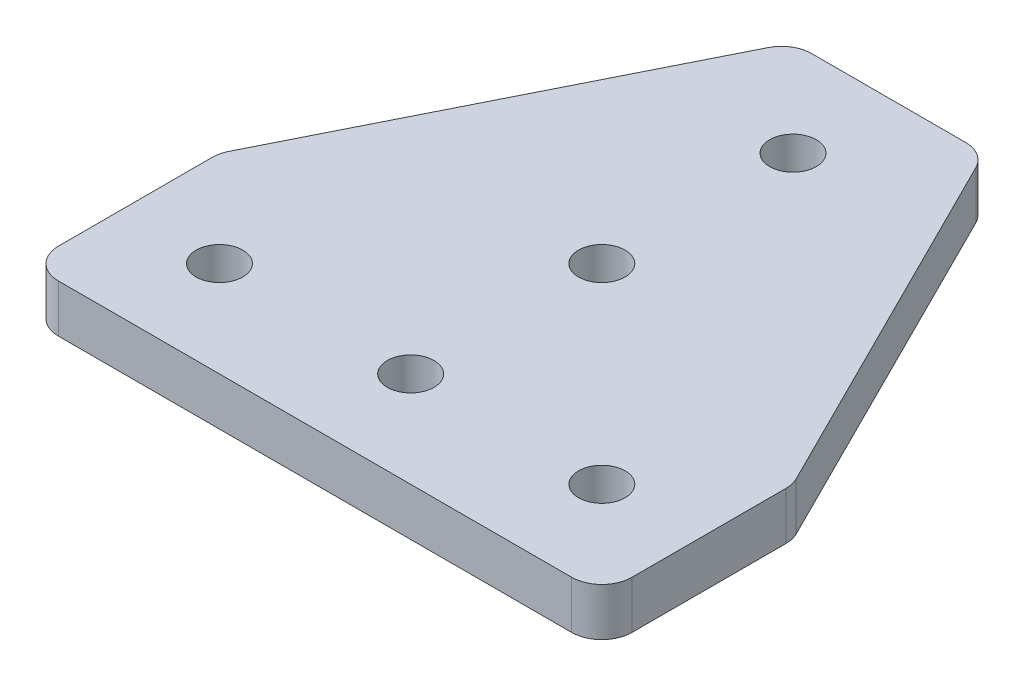
ISO-10303-21;
HEADER;
FILE_DESCRIPTION(('STEP AP214'),'2;1');
FILE_NAME('part.step','',(''),(''),'','','');
FILE_SCHEMA(('AUTOMOTIVE_DESIGN { 1 0 10303 214 1 1 1 1 }'));
ENDSEC;
DATA;
#1=APPLICATION_CONTEXT('core data for automotive mechanical design processes');
#2=APPLICATION_PROTOCOL_DEFINITION('international standard','automotive_design',2000,#1);
#3=PRODUCT_CONTEXT('',#1,'mechanical');
#4=PRODUCT('Part','Part','',(#3));
#5=PRODUCT_RELATED_PRODUCT_CATEGORY('part','',(#4));
#6=PRODUCT_DEFINITION_FORMATION('','',#4);
#7=PRODUCT_DEFINITION_CONTEXT('part definition',#1,'design');
#8=PRODUCT_DEFINITION('design','',#6,#7);
#9=PRODUCT_DEFINITION_SHAPE('','',#8);
#10=(LENGTH_UNIT() NAMED_UNIT(*) SI_UNIT(.MILLI.,.METRE.));
#11=(NAMED_UNIT(*) PLANE_ANGLE_UNIT() SI_UNIT($,.RADIAN.));
#12=(NAMED_UNIT(*) SI_UNIT($,.STERADIAN.) SOLID_ANGLE_UNIT());
#13=UNCERTAINTY_MEASURE_WITH_UNIT(LENGTH_MEASURE(1.E-05),#10,'distance_accuracy_value','');
#14=(GEOMETRIC_REPRESENTATION_CONTEXT(3) GLOBAL_UNCERTAINTY_ASSIGNED_CONTEXT((#13)) GLOBAL_UNIT_ASSIGNED_CONTEXT((#10,
#11,#12)) REPRESENTATION_CONTEXT('',''));
#15=CARTESIAN_POINT('',(0.,0.,0.));
#16=DIRECTION('',(0.,0.,1.));
#17=DIRECTION('',(1.,0.,0.));
#18=AXIS2_PLACEMENT_3D('',#15,#16,#17);
#19=CARTESIAN_POINT('',(0.,6.35,0.));
#20=DIRECTION('',(0.,-1.,0.));
#21=DIRECTION('',(0.,0.,-1.));
#22=AXIS2_PLACEMENT_3D('',#19,#20,#21);
#23=PLANE('',#22);
#24=DIRECTION('',(-0.447213595499958,0.,-0.894427190999916));
#25=VECTOR('',#24,1.);
#26=CARTESIAN_POINT('',(12.7,6.35,-63.5));
#27=LINE('',#26,#25);
#28=CARTESIAN_POINT('',(37.6777087639997,6.35,-13.5445824720007));
#29=VERTEX_POINT('',#28);
#30=CARTESIAN_POINT('',(13.8055728090001,6.35,-61.2888543819998));
#31=VERTEX_POINT('',#30);
#32=EDGE_CURVE('E219',#29,#31,#27,.T.);
#33=ORIENTED_EDGE('',*,*,#32,.T.);
#34=CARTESIAN_POINT('',(10.2278640450004,6.35,-59.5));
#35=DIRECTION('',(0.,-1.,0.));
#36=DIRECTION('',(0.,0.,-1.));
#37=AXIS2_PLACEMENT_3D('',#34,#35,#36);
#38=CIRCLE('',#37,4.);
#39=CARTESIAN_POINT('',(10.2278640450004,6.35,-63.5));
#40=VERTEX_POINT('',#39);
#41=EDGE_CURVE('E188',#31,#40,#38,.F.);
#42=ORIENTED_EDGE('',*,*,#41,.T.);
#43=DIRECTION('',(-1.,0.,0.));
#44=VECTOR('',#43,1.);
#45=CARTESIAN_POINT('',(-12.7,6.35,-63.5));
#46=LINE('',#45,#44);
#47=CARTESIAN_POINT('',(-10.2278640450004,6.35,-63.5));
#48=VERTEX_POINT('',#47);
#49=EDGE_CURVE('E144',#40,#48,#46,.T.);
#50=ORIENTED_EDGE('',*,*,#49,.T.);
#51=CARTESIAN_POINT('',(-10.2278640450004,6.35,-59.5));
#52=DIRECTION('',(0.,-1.,0.));
#53=DIRECTION('',(0.,0.,-1.));
#54=AXIS2_PLACEMENT_3D('',#51,#52,#53);
#55=CIRCLE('',#54,4.);
#56=CARTESIAN_POINT('',(-13.8055728090001,6.35,-61.2888543819998));
#57=VERTEX_POINT('',#56);
#58=EDGE_CURVE('E186',#48,#57,#55,.F.);
#59=ORIENTED_EDGE('',*,*,#58,.T.);
#60=DIRECTION('',(-0.447213595499958,0.,0.894427190999916));
#61=VECTOR('',#60,1.);
#62=CARTESIAN_POINT('',(-38.1,6.35,-12.7));
#63=LINE('',#62,#61);
#64=CARTESIAN_POINT('',(-37.6777087639997,6.35,-13.5445824720007));
#65=VERTEX_POINT('',#64);
#66=EDGE_CURVE('E231',#57,#65,#63,.T.);
#67=ORIENTED_EDGE('',*,*,#66,.T.);
#68=CARTESIAN_POINT('',(-34.1,6.35,-11.7557280900009));
#69=DIRECTION('',(0.,-1.,0.));
#70=DIRECTION('',(0.,0.,-1.));
#71=AXIS2_PLACEMENT_3D('',#68,#69,#70);
#72=CIRCLE('',#71,4.);
#73=CARTESIAN_POINT('',(-38.1,6.35,-11.7557280900009));
#74=VERTEX_POINT('',#73);
#75=EDGE_CURVE('E55',#65,#74,#72,.F.);
#76=ORIENTED_EDGE('',*,*,#75,.T.);
#77=DIRECTION('',(0.,0.,1.));
#78=VECTOR('',#77,1.);
#79=CARTESIAN_POINT('',(-38.1,6.35,12.7));
#80=LINE('',#79,#78);
#81=CARTESIAN_POINT('',(-38.1,6.35,8.69999999999999));
#82=VERTEX_POINT('',#81);
#83=EDGE_CURVE('E166',#74,#82,#80,.T.);
#84=ORIENTED_EDGE('',*,*,#83,.T.);
#85=CARTESIAN_POINT('',(-34.1,6.35,8.69999999999999));
#86=DIRECTION('',(0.,-1.,0.));
#87=DIRECTION('',(0.,0.,-1.));
#88=AXIS2_PLACEMENT_3D('',#85,#86,#87);
#89=CIRCLE('',#88,4.);
#90=CARTESIAN_POINT('',(-34.1,6.35,12.7));
#91=VERTEX_POINT('',#90);
#92=EDGE_CURVE('E183',#82,#91,#89,.F.);
#93=ORIENTED_EDGE('',*,*,#92,.T.);
#94=DIRECTION('',(1.,0.,0.));
#95=VECTOR('',#94,1.);
#96=CARTESIAN_POINT('',(38.1,6.35,12.7));
#97=LINE('',#96,#95);
#98=CARTESIAN_POINT('',(34.1,6.35,12.7));
#99=VERTEX_POINT('',#98);
#100=EDGE_CURVE('E165',#91,#99,#97,.T.);
#101=ORIENTED_EDGE('',*,*,#100,.T.);
#102=CARTESIAN_POINT('',(34.1,6.35,8.70000000000002));
#103=DIRECTION('',(0.,-1.,0.));
#104=DIRECTION('',(0.,0.,-1.));
#105=AXIS2_PLACEMENT_3D('',#102,#103,#104);
#106=CIRCLE('',#105,4.);
#107=CARTESIAN_POINT('',(38.1,6.35,8.70000000000002));
#108=VERTEX_POINT('',#107);
#109=EDGE_CURVE('E181',#99,#108,#106,.F.);
#110=ORIENTED_EDGE('',*,*,#109,.T.);
#111=DIRECTION('',(0.,0.,-1.));
#112=VECTOR('',#111,1.);
#113=CARTESIAN_POINT('',(38.1,6.35,-12.7));
#114=LINE('',#113,#112);
#115=CARTESIAN_POINT('',(38.1,6.35,-11.7557280900008));
#116=VERTEX_POINT('',#115);
#117=EDGE_CURVE('E209',#108,#116,#114,.T.);
#118=ORIENTED_EDGE('',*,*,#117,.T.);
#119=CARTESIAN_POINT('',(34.1,6.35,-11.7557280900008));
#120=DIRECTION('',(0.,-1.,0.));
#121=DIRECTION('',(0.,0.,-1.));
#122=AXIS2_PLACEMENT_3D('',#119,#120,#121);
#123=CIRCLE('',#122,4.);
#124=EDGE_CURVE('E179',#116,#29,#123,.F.);
#125=ORIENTED_EDGE('',*,*,#124,.T.);
#126=EDGE_LOOP('',(#33,#42,#50,#59,#67,#76,#84,#93,#101,#110,#118,#125));
#127=FACE_BOUND('',#126,.T.);
#128=CARTESIAN_POINT('',(0.,6.35,-50.8));
#129=DIRECTION('',(0.,1.,0.));
#130=DIRECTION('',(0.,0.,1.));
#131=AXIS2_PLACEMENT_3D('',#128,#129,#130);
#132=CIRCLE('',#131,3.1);
#133=CARTESIAN_POINT('',(0.,6.35,-47.7));
#134=VERTEX_POINT('',#133);
#135=EDGE_CURVE('E225',#134,#134,#132,.T.);
#136=ORIENTED_EDGE('',*,*,#135,.F.);
#137=EDGE_LOOP('',(#136));
#138=FACE_BOUND('',#137,.T.);
#139=CARTESIAN_POINT('',(0.,6.35,-25.4));
#140=DIRECTION('',(0.,1.,0.));
#141=DIRECTION('',(0.,0.,1.));
#142=AXIS2_PLACEMENT_3D('',#139,#140,#141);
#143=CIRCLE('',#142,3.1);
#144=CARTESIAN_POINT('',(0.,6.35,-22.3));
#145=VERTEX_POINT('',#144);
#146=EDGE_CURVE('E237',#145,#145,#143,.T.);
#147=ORIENTED_EDGE('',*,*,#146,.F.);
#148=EDGE_LOOP('',(#147));
#149=FACE_BOUND('',#148,.T.);
#150=CARTESIAN_POINT('',(25.4,6.35,0.));
#151=DIRECTION('',(0.,1.,0.));
#152=DIRECTION('',(0.,0.,1.));
#153=AXIS2_PLACEMENT_3D('',#150,#151,#152);
#154=CIRCLE('',#153,3.1);
#155=CARTESIAN_POINT('',(25.4,6.35,3.1));
#156=VERTEX_POINT('',#155);
#157=EDGE_CURVE('E242',#156,#156,#154,.T.);
#158=ORIENTED_EDGE('',*,*,#157,.F.);
#159=EDGE_LOOP('',(#158));
#160=FACE_BOUND('',#159,.T.);
#161=CARTESIAN_POINT('',(0.,6.35,0.));
#162=DIRECTION('',(0.,1.,0.));
#163=DIRECTION('',(0.,0.,1.));
#164=AXIS2_PLACEMENT_3D('',#161,#162,#163);
#165=CIRCLE('',#164,3.1);
#166=CARTESIAN_POINT('',(0.,6.35,3.1));
#167=VERTEX_POINT('',#166);
#168=EDGE_CURVE('E248',#167,#167,#165,.T.);
#169=ORIENTED_EDGE('',*,*,#168,.F.);
#170=EDGE_LOOP('',(#169));
#171=FACE_BOUND('',#170,.T.);
#172=CARTESIAN_POINT('',(-25.4,6.35,0.));
#173=DIRECTION('',(0.,1.,0.));
#174=DIRECTION('',(0.,0.,1.));
#175=AXIS2_PLACEMENT_3D('',#172,#173,#174);
#176=CIRCLE('',#175,3.1);
#177=CARTESIAN_POINT('',(-25.4,6.35,3.1));
#178=VERTEX_POINT('',#177);
#179=EDGE_CURVE('E254',#178,#178,#176,.T.);
#180=ORIENTED_EDGE('',*,*,#179,.F.);
#181=EDGE_LOOP('',(#180));
#182=FACE_BOUND('',#181,.T.);
#183=ADVANCED_FACE('F33',(#127,#138,#149,#160,#171,#182),#23,.F.);
#184=CARTESIAN_POINT('',(0.,0.,0.));
#185=DIRECTION('',(0.,-1.,0.));
#186=DIRECTION('',(0.,0.,-1.));
#187=AXIS2_PLACEMENT_3D('',#184,#185,#186);
#188=PLANE('',#187);
#189=CARTESIAN_POINT('',(0.,0.,0.));
#190=DIRECTION('',(0.,1.,0.));
#191=DIRECTION('',(0.,0.,1.));
#192=AXIS2_PLACEMENT_3D('',#189,#190,#191);
#193=CIRCLE('',#192,3.1);
#194=CARTESIAN_POINT('',(0.,0.,3.1));
#195=VERTEX_POINT('',#194);
#196=EDGE_CURVE('E251',#195,#195,#193,.T.);
#197=ORIENTED_EDGE('',*,*,#196,.T.);
#198=EDGE_LOOP('',(#197));
#199=FACE_BOUND('',#198,.T.);
#200=CARTESIAN_POINT('',(0.,0.,-25.4));
#201=DIRECTION('',(0.,1.,0.));
#202=DIRECTION('',(0.,0.,1.));
#203=AXIS2_PLACEMENT_3D('',#200,#201,#202);
#204=CIRCLE('',#203,3.1);
#205=CARTESIAN_POINT('',(0.,0.,-22.3));
#206=VERTEX_POINT('',#205);
#207=EDGE_CURVE('E239',#206,#206,#204,.T.);
#208=ORIENTED_EDGE('',*,*,#207,.T.);
#209=EDGE_LOOP('',(#208));
#210=FACE_BOUND('',#209,.T.);
#211=DIRECTION('',(-1.,0.,0.));
#212=VECTOR('',#211,1.);
#213=CARTESIAN_POINT('',(-12.7,0.,-63.5));
#214=LINE('',#213,#212);
#215=CARTESIAN_POINT('',(10.2278640450004,0.,-63.5));
#216=VERTEX_POINT('',#215);
#217=CARTESIAN_POINT('',(-10.2278640450004,0.,-63.5));
#218=VERTEX_POINT('',#217);
#219=EDGE_CURVE('E141',#216,#218,#214,.T.);
#220=ORIENTED_EDGE('',*,*,#219,.F.);
#221=CARTESIAN_POINT('',(10.2278640450004,0.,-59.5));
#222=DIRECTION('',(0.,-1.,0.));
#223=DIRECTION('',(0.,0.,-1.));
#224=AXIS2_PLACEMENT_3D('',#221,#222,#223);
#225=CIRCLE('',#224,4.);
#226=CARTESIAN_POINT('',(13.8055728090001,0.,-61.2888543819998));
#227=VERTEX_POINT('',#226);
#228=EDGE_CURVE('E124',#216,#227,#225,.T.);
#229=ORIENTED_EDGE('',*,*,#228,.T.);
#230=DIRECTION('',(-0.447213595499958,0.,-0.894427190999916));
#231=VECTOR('',#230,1.);
#232=CARTESIAN_POINT('',(12.7,0.,-63.5));
#233=LINE('',#232,#231);
#234=CARTESIAN_POINT('',(37.6777087639997,0.,-13.5445824720007));
#235=VERTEX_POINT('',#234);
#236=EDGE_CURVE('E152',#235,#227,#233,.T.);
#237=ORIENTED_EDGE('',*,*,#236,.F.);
#238=CARTESIAN_POINT('',(34.1,0.,-11.7557280900008));
#239=DIRECTION('',(0.,-1.,0.));
#240=DIRECTION('',(0.,0.,-1.));
#241=AXIS2_PLACEMENT_3D('',#238,#239,#240);
#242=CIRCLE('',#241,4.);
#243=CARTESIAN_POINT('',(38.1,0.,-11.7557280900008));
#244=VERTEX_POINT('',#243);
#245=EDGE_CURVE('E145',#235,#244,#242,.T.);
#246=ORIENTED_EDGE('',*,*,#245,.T.);
#247=DIRECTION('',(0.,0.,-1.));
#248=VECTOR('',#247,1.);
#249=CARTESIAN_POINT('',(38.1,0.,-12.7));
#250=LINE('',#249,#248);
#251=CARTESIAN_POINT('',(38.1,0.,8.70000000000002));
#252=VERTEX_POINT('',#251);
#253=EDGE_CURVE('E157',#252,#244,#250,.T.);
#254=ORIENTED_EDGE('',*,*,#253,.F.);
#255=CARTESIAN_POINT('',(34.1,0.,8.70000000000002));
#256=DIRECTION('',(0.,-1.,0.));
#257=DIRECTION('',(0.,0.,-1.));
#258=AXIS2_PLACEMENT_3D('',#255,#256,#257);
#259=CIRCLE('',#258,4.);
#260=CARTESIAN_POINT('',(34.1,0.,12.7));
#261=VERTEX_POINT('',#260);
#262=EDGE_CURVE('E169',#252,#261,#259,.T.);
#263=ORIENTED_EDGE('',*,*,#262,.T.);
#264=DIRECTION('',(1.,0.,0.));
#265=VECTOR('',#264,1.);
#266=CARTESIAN_POINT('',(0.,0.,12.7));
#267=LINE('',#266,#265);
#268=CARTESIAN_POINT('',(-34.1,0.,12.7));
#269=VERTEX_POINT('',#268);
#270=EDGE_CURVE('E162',#269,#261,#267,.T.);
#271=ORIENTED_EDGE('',*,*,#270,.F.);
#272=CARTESIAN_POINT('',(-34.1,0.,8.69999999999999));
#273=DIRECTION('',(0.,-1.,0.));
#274=DIRECTION('',(0.,0.,-1.));
#275=AXIS2_PLACEMENT_3D('',#272,#273,#274);
#276=CIRCLE('',#275,4.);
#277=CARTESIAN_POINT('',(-38.1,0.,8.69999999999999));
#278=VERTEX_POINT('',#277);
#279=EDGE_CURVE('E171',#269,#278,#276,.T.);
#280=ORIENTED_EDGE('',*,*,#279,.T.);
#281=DIRECTION('',(0.,0.,1.));
#282=VECTOR('',#281,1.);
#283=CARTESIAN_POINT('',(-38.1,0.,12.7));
#284=LINE('',#283,#282);
#285=CARTESIAN_POINT('',(-38.1,0.,-11.7557280900009));
#286=VERTEX_POINT('',#285);
#287=EDGE_CURVE('E155',#286,#278,#284,.T.);
#288=ORIENTED_EDGE('',*,*,#287,.F.);
#289=CARTESIAN_POINT('',(-34.1,0.,-11.7557280900009));
#290=DIRECTION('',(0.,-1.,0.));
#291=DIRECTION('',(0.,0.,-1.));
#292=AXIS2_PLACEMENT_3D('',#289,#290,#291);
#293=CIRCLE('',#292,4.);
#294=CARTESIAN_POINT('',(-37.6777087639997,0.,-13.5445824720007));
#295=VERTEX_POINT('',#294);
#296=EDGE_CURVE('E173',#286,#295,#293,.T.);
#297=ORIENTED_EDGE('',*,*,#296,.T.);
#298=DIRECTION('',(-0.447213595499958,0.,0.894427190999916));
#299=VECTOR('',#298,1.);
#300=CARTESIAN_POINT('',(-38.1,0.,-12.7));
#301=LINE('',#300,#299);
#302=CARTESIAN_POINT('',(-13.8055728090001,0.,-61.2888543819998));
#303=VERTEX_POINT('',#302);
#304=EDGE_CURVE('E151',#303,#295,#301,.T.);
#305=ORIENTED_EDGE('',*,*,#304,.F.);
#306=CARTESIAN_POINT('',(-10.2278640450004,0.,-59.5));
#307=DIRECTION('',(0.,-1.,0.));
#308=DIRECTION('',(0.,0.,-1.));
#309=AXIS2_PLACEMENT_3D('',#306,#307,#308);
#310=CIRCLE('',#309,4.);
#311=EDGE_CURVE('E135',#303,#218,#310,.T.);
#312=ORIENTED_EDGE('',*,*,#311,.T.);
#313=EDGE_LOOP('',(#220,#229,#237,#246,#254,#263,#271,#280,#288,#297,#305,#312));
#314=FACE_BOUND('',#313,.T.);
#315=CARTESIAN_POINT('',(0.,0.,-50.8));
#316=DIRECTION('',(0.,1.,0.));
#317=DIRECTION('',(0.,0.,1.));
#318=AXIS2_PLACEMENT_3D('',#315,#316,#317);
#319=CIRCLE('',#318,3.1);
#320=CARTESIAN_POINT('',(0.,0.,-47.7));
#321=VERTEX_POINT('',#320);
#322=EDGE_CURVE('E227',#321,#321,#319,.T.);
#323=ORIENTED_EDGE('',*,*,#322,.T.);
#324=EDGE_LOOP('',(#323));
#325=FACE_BOUND('',#324,.T.);
#326=CARTESIAN_POINT('',(25.4,0.,0.));
#327=DIRECTION('',(0.,1.,0.));
#328=DIRECTION('',(0.,0.,1.));
#329=AXIS2_PLACEMENT_3D('',#326,#327,#328);
#330=CIRCLE('',#329,3.1);
#331=CARTESIAN_POINT('',(25.4,0.,3.1));
#332=VERTEX_POINT('',#331);
#333=EDGE_CURVE('E245',#332,#332,#330,.T.);
#334=ORIENTED_EDGE('',*,*,#333,.T.);
#335=EDGE_LOOP('',(#334));
#336=FACE_BOUND('',#335,.T.);
#337=CARTESIAN_POINT('',(-25.4,0.,0.));
#338=DIRECTION('',(0.,1.,0.));
#339=DIRECTION('',(0.,0.,1.));
#340=AXIS2_PLACEMENT_3D('',#337,#338,#339);
#341=CIRCLE('',#340,3.1);
#342=CARTESIAN_POINT('',(-25.4,0.,3.1));
#343=VERTEX_POINT('',#342);
#344=EDGE_CURVE('E257',#343,#343,#341,.T.);
#345=ORIENTED_EDGE('',*,*,#344,.T.);
#346=EDGE_LOOP('',(#345));
#347=FACE_BOUND('',#346,.T.);
#348=ADVANCED_FACE('F148',(#199,#210,#314,#325,#336,#347),#188,.T.);
#349=CARTESIAN_POINT('',(38.1,6.35,-12.7));
#350=DIRECTION('',(-1.,0.,0.));
#351=DIRECTION('',(0.,0.,1.));
#352=AXIS2_PLACEMENT_3D('',#349,#350,#351);
#353=PLANE('',#352);
#354=ORIENTED_EDGE('',*,*,#117,.F.);
#355=DIRECTION('',(0.,-1.,0.));
#356=VECTOR('',#355,1.);
#357=CARTESIAN_POINT('',(38.1,6.35,8.70000000000002));
#358=LINE('',#357,#356);
#359=EDGE_CURVE('E11',#108,#252,#358,.T.);
#360=ORIENTED_EDGE('',*,*,#359,.T.);
#361=ORIENTED_EDGE('',*,*,#253,.T.);
#362=DIRECTION('',(0.,-1.,0.));
#363=VECTOR('',#362,1.);
#364=CARTESIAN_POINT('',(38.1,6.35,-11.7557280900008));
#365=LINE('',#364,#363);
#366=EDGE_CURVE('E41',#244,#116,#365,.F.);
#367=ORIENTED_EDGE('',*,*,#366,.T.);
#368=EDGE_LOOP('',(#354,#360,#361,#367));
#369=FACE_BOUND('',#368,.T.);
#370=ADVANCED_FACE('F208',(#369),#353,.F.);
#371=CARTESIAN_POINT('',(12.7,6.35,-63.5));
#372=DIRECTION('',(-0.894427190999916,0.,0.447213595499958));
#373=DIRECTION('',(0.447213595499958,0.,0.894427190999916));
#374=AXIS2_PLACEMENT_3D('',#371,#372,#373);
#375=PLANE('',#374);
#376=ORIENTED_EDGE('',*,*,#236,.T.);
#377=DIRECTION('',(0.,-1.,0.));
#378=VECTOR('',#377,1.);
#379=CARTESIAN_POINT('',(13.8055728090001,6.35,-61.2888543819998));
#380=LINE('',#379,#378);
#381=EDGE_CURVE('E129',#227,#31,#380,.F.);
#382=ORIENTED_EDGE('',*,*,#381,.T.);
#383=ORIENTED_EDGE('',*,*,#32,.F.);
#384=DIRECTION('',(0.,-1.,0.));
#385=VECTOR('',#384,1.);
#386=CARTESIAN_POINT('',(37.6777087639997,6.35,-13.5445824720007));
#387=LINE('',#386,#385);
#388=EDGE_CURVE('E134',#29,#235,#387,.T.);
#389=ORIENTED_EDGE('',*,*,#388,.T.);
#390=EDGE_LOOP('',(#376,#382,#383,#389));
#391=FACE_BOUND('',#390,.T.);
#392=ADVANCED_FACE('F223',(#391),#375,.F.);
#393=CARTESIAN_POINT('',(-12.7,6.35,-63.5));
#394=DIRECTION('',(0.,0.,1.));
#395=DIRECTION('',(1.,0.,0.));
#396=AXIS2_PLACEMENT_3D('',#393,#394,#395);
#397=PLANE('',#396);
#398=ORIENTED_EDGE('',*,*,#49,.F.);
#399=DIRECTION('',(0.,-1.,0.));
#400=VECTOR('',#399,1.);
#401=CARTESIAN_POINT('',(10.2278640450004,6.35,-63.5));
#402=LINE('',#401,#400);
#403=EDGE_CURVE('E128',#40,#216,#402,.T.);
#404=ORIENTED_EDGE('',*,*,#403,.T.);
#405=ORIENTED_EDGE('',*,*,#219,.T.);
#406=DIRECTION('',(0.,-1.,0.));
#407=VECTOR('',#406,1.);
#408=CARTESIAN_POINT('',(-10.2278640450004,6.35,-63.5));
#409=LINE('',#408,#407);
#410=EDGE_CURVE('E146',#218,#48,#409,.F.);
#411=ORIENTED_EDGE('',*,*,#410,.T.);
#412=EDGE_LOOP('',(#398,#404,#405,#411));
#413=FACE_BOUND('',#412,.T.);
#414=ADVANCED_FACE('F140',(#413),#397,.F.);
#415=CARTESIAN_POINT('',(-38.1,6.35,-12.7));
#416=DIRECTION('',(0.894427190999916,0.,0.447213595499958));
#417=DIRECTION('',(0.447213595499958,0.,-0.894427190999916));
#418=AXIS2_PLACEMENT_3D('',#415,#416,#417);
#419=PLANE('',#418);
#420=ORIENTED_EDGE('',*,*,#66,.F.);
#421=DIRECTION('',(0.,-1.,0.));
#422=VECTOR('',#421,1.);
#423=CARTESIAN_POINT('',(-13.8055728090001,6.35,-61.2888543819998));
#424=LINE('',#423,#422);
#425=EDGE_CURVE('E192',#57,#303,#424,.T.);
#426=ORIENTED_EDGE('',*,*,#425,.T.);
#427=ORIENTED_EDGE('',*,*,#304,.T.);
#428=DIRECTION('',(0.,-1.,0.));
#429=VECTOR('',#428,1.);
#430=CARTESIAN_POINT('',(-37.6777087639997,6.35,-13.5445824720007));
#431=LINE('',#430,#429);
#432=EDGE_CURVE('E190',#295,#65,#431,.F.);
#433=ORIENTED_EDGE('',*,*,#432,.T.);
#434=EDGE_LOOP('',(#420,#426,#427,#433));
#435=FACE_BOUND('',#434,.T.);
#436=ADVANCED_FACE('F284',(#435),#419,.F.);
#437=CARTESIAN_POINT('',(-38.1,6.35,12.7));
#438=DIRECTION('',(1.,0.,0.));
#439=DIRECTION('',(0.,0.,-1.));
#440=AXIS2_PLACEMENT_3D('',#437,#438,#439);
#441=PLANE('',#440);
#442=ORIENTED_EDGE('',*,*,#83,.F.);
#443=DIRECTION('',(0.,-1.,0.));
#444=VECTOR('',#443,1.);
#445=CARTESIAN_POINT('',(-38.1,6.35,-11.7557280900009));
#446=LINE('',#445,#444);
#447=EDGE_CURVE('E196',#74,#286,#446,.T.);
#448=ORIENTED_EDGE('',*,*,#447,.T.);
#449=ORIENTED_EDGE('',*,*,#287,.T.);
#450=DIRECTION('',(0.,-1.,0.));
#451=VECTOR('',#450,1.);
#452=CARTESIAN_POINT('',(-38.1,6.35,8.69999999999999));
#453=LINE('',#452,#451);
#454=EDGE_CURVE('E48',#278,#82,#453,.F.);
#455=ORIENTED_EDGE('',*,*,#454,.T.);
#456=EDGE_LOOP('',(#442,#448,#449,#455));
#457=FACE_BOUND('',#456,.T.);
#458=ADVANCED_FACE('F280',(#457),#441,.F.);
#459=CARTESIAN_POINT('',(0.,6.35,12.7));
#460=DIRECTION('',(0.,0.,-1.));
#461=DIRECTION('',(-1.,0.,0.));
#462=AXIS2_PLACEMENT_3D('',#459,#460,#461);
#463=PLANE('',#462);
#464=ORIENTED_EDGE('',*,*,#100,.F.);
#465=DIRECTION('',(0.,-1.,0.));
#466=VECTOR('',#465,1.);
#467=CARTESIAN_POINT('',(-34.1,6.35,12.7));
#468=LINE('',#467,#466);
#469=EDGE_CURVE('E201',#91,#269,#468,.T.);
#470=ORIENTED_EDGE('',*,*,#469,.T.);
#471=ORIENTED_EDGE('',*,*,#270,.T.);
#472=DIRECTION('',(0.,-1.,0.));
#473=VECTOR('',#472,1.);
#474=CARTESIAN_POINT('',(34.1,6.35,12.7));
#475=LINE('',#474,#473);
#476=EDGE_CURVE('E199',#261,#99,#475,.F.);
#477=ORIENTED_EDGE('',*,*,#476,.T.);
#478=EDGE_LOOP('',(#464,#470,#471,#477));
#479=FACE_BOUND('',#478,.T.);
#480=ADVANCED_FACE('F277',(#479),#463,.F.);
#481=CARTESIAN_POINT('',(0.,6.35,-50.8));
#482=DIRECTION('',(0.,-1.,0.));
#483=DIRECTION('',(0.,0.,-1.));
#484=AXIS2_PLACEMENT_3D('',#481,#482,#483);
#485=CYLINDRICAL_SURFACE('',#484,3.1);
#486=ORIENTED_EDGE('',*,*,#135,.T.);
#487=EDGE_LOOP('',(#486));
#488=FACE_BOUND('',#487,.T.);
#489=ORIENTED_EDGE('',*,*,#322,.F.);
#490=EDGE_LOOP('',(#489));
#491=FACE_BOUND('',#490,.T.);
#492=ADVANCED_FACE('F274',(#488,#491),#485,.F.);
#493=CARTESIAN_POINT('',(0.,6.35,-25.4));
#494=DIRECTION('',(0.,-1.,0.));
#495=DIRECTION('',(0.,0.,-1.));
#496=AXIS2_PLACEMENT_3D('',#493,#494,#495);
#497=CYLINDRICAL_SURFACE('',#496,3.1);
#498=ORIENTED_EDGE('',*,*,#146,.T.);
#499=EDGE_LOOP('',(#498));
#500=FACE_BOUND('',#499,.T.);
#501=ORIENTED_EDGE('',*,*,#207,.F.);
#502=EDGE_LOOP('',(#501));
#503=FACE_BOUND('',#502,.T.);
#504=ADVANCED_FACE('F430',(#500,#503),#497,.F.);
#505=CARTESIAN_POINT('',(25.4,6.35,0.));
#506=DIRECTION('',(0.,-1.,0.));
#507=DIRECTION('',(0.,0.,-1.));
#508=AXIS2_PLACEMENT_3D('',#505,#506,#507);
#509=CYLINDRICAL_SURFACE('',#508,3.1);
#510=ORIENTED_EDGE('',*,*,#157,.T.);
#511=EDGE_LOOP('',(#510));
#512=FACE_BOUND('',#511,.T.);
#513=ORIENTED_EDGE('',*,*,#333,.F.);
#514=EDGE_LOOP('',(#513));
#515=FACE_BOUND('',#514,.T.);
#516=ADVANCED_FACE('F420',(#512,#515),#509,.F.);
#517=CARTESIAN_POINT('',(0.,6.35,0.));
#518=DIRECTION('',(0.,-1.,0.));
#519=DIRECTION('',(0.,0.,-1.));
#520=AXIS2_PLACEMENT_3D('',#517,#518,#519);
#521=CYLINDRICAL_SURFACE('',#520,3.1);
#522=ORIENTED_EDGE('',*,*,#168,.T.);
#523=EDGE_LOOP('',(#522));
#524=FACE_BOUND('',#523,.T.);
#525=ORIENTED_EDGE('',*,*,#196,.F.);
#526=EDGE_LOOP('',(#525));
#527=FACE_BOUND('',#526,.T.);
#528=ADVANCED_FACE('F411',(#524,#527),#521,.F.);
#529=CARTESIAN_POINT('',(-25.4,6.35,0.));
#530=DIRECTION('',(0.,-1.,0.));
#531=DIRECTION('',(0.,0.,-1.));
#532=AXIS2_PLACEMENT_3D('',#529,#530,#531);
#533=CYLINDRICAL_SURFACE('',#532,3.1);
#534=ORIENTED_EDGE('',*,*,#179,.T.);
#535=EDGE_LOOP('',(#534));
#536=FACE_BOUND('',#535,.T.);
#537=ORIENTED_EDGE('',*,*,#344,.F.);
#538=EDGE_LOOP('',(#537));
#539=FACE_BOUND('',#538,.T.);
#540=ADVANCED_FACE('F263',(#536,#539),#533,.F.);
#541=CARTESIAN_POINT('',(10.2278640450004,6.35,-59.5));
#542=DIRECTION('',(0.,-1.,0.));
#543=DIRECTION('',(0.,0.,-1.));
#544=AXIS2_PLACEMENT_3D('',#541,#542,#543);
#545=CYLINDRICAL_SURFACE('',#544,4.);
#546=ORIENTED_EDGE('',*,*,#41,.F.);
#547=ORIENTED_EDGE('',*,*,#381,.F.);
#548=ORIENTED_EDGE('',*,*,#228,.F.);
#549=ORIENTED_EDGE('',*,*,#403,.F.);
#550=EDGE_LOOP('',(#546,#547,#548,#549));
#551=FACE_BOUND('',#550,.T.);
#552=ADVANCED_FACE('F127',(#551),#545,.T.);
#553=CARTESIAN_POINT('',(-10.2278640450004,6.35,-59.5));
#554=DIRECTION('',(0.,-1.,0.));
#555=DIRECTION('',(0.,0.,-1.));
#556=AXIS2_PLACEMENT_3D('',#553,#554,#555);
#557=CYLINDRICAL_SURFACE('',#556,4.);
#558=ORIENTED_EDGE('',*,*,#58,.F.);
#559=ORIENTED_EDGE('',*,*,#410,.F.);
#560=ORIENTED_EDGE('',*,*,#311,.F.);
#561=ORIENTED_EDGE('',*,*,#425,.F.);
#562=EDGE_LOOP('',(#558,#559,#560,#561));
#563=FACE_BOUND('',#562,.T.);
#564=ADVANCED_FACE('F296',(#563),#557,.T.);
#565=CARTESIAN_POINT('',(-34.1,6.35,-11.7557280900009));
#566=DIRECTION('',(0.,-1.,0.));
#567=DIRECTION('',(0.,0.,-1.));
#568=AXIS2_PLACEMENT_3D('',#565,#566,#567);
#569=CYLINDRICAL_SURFACE('',#568,4.);
#570=ORIENTED_EDGE('',*,*,#75,.F.);
#571=ORIENTED_EDGE('',*,*,#432,.F.);
#572=ORIENTED_EDGE('',*,*,#296,.F.);
#573=ORIENTED_EDGE('',*,*,#447,.F.);
#574=EDGE_LOOP('',(#570,#571,#572,#573));
#575=FACE_BOUND('',#574,.T.);
#576=ADVANCED_FACE('F299',(#575),#569,.T.);
#577=CARTESIAN_POINT('',(-34.1,6.35,8.69999999999999));
#578=DIRECTION('',(0.,-1.,0.));
#579=DIRECTION('',(0.,0.,-1.));
#580=AXIS2_PLACEMENT_3D('',#577,#578,#579);
#581=CYLINDRICAL_SURFACE('',#580,4.);
#582=ORIENTED_EDGE('',*,*,#92,.F.);
#583=ORIENTED_EDGE('',*,*,#454,.F.);
#584=ORIENTED_EDGE('',*,*,#279,.F.);
#585=ORIENTED_EDGE('',*,*,#469,.F.);
#586=EDGE_LOOP('',(#582,#583,#584,#585));
#587=FACE_BOUND('',#586,.T.);
#588=ADVANCED_FACE('F303',(#587),#581,.T.);
#589=CARTESIAN_POINT('',(34.1,6.35,8.70000000000002));
#590=DIRECTION('',(0.,-1.,0.));
#591=DIRECTION('',(0.,0.,-1.));
#592=AXIS2_PLACEMENT_3D('',#589,#590,#591);
#593=CYLINDRICAL_SURFACE('',#592,4.);
#594=ORIENTED_EDGE('',*,*,#109,.F.);
#595=ORIENTED_EDGE('',*,*,#476,.F.);
#596=ORIENTED_EDGE('',*,*,#262,.F.);
#597=ORIENTED_EDGE('',*,*,#359,.F.);
#598=EDGE_LOOP('',(#594,#595,#596,#597));
#599=FACE_BOUND('',#598,.T.);
#600=ADVANCED_FACE('F306',(#599),#593,.T.);
#601=CARTESIAN_POINT('',(34.1,6.35,-11.7557280900008));
#602=DIRECTION('',(0.,-1.,0.));
#603=DIRECTION('',(0.,0.,-1.));
#604=AXIS2_PLACEMENT_3D('',#601,#602,#603);
#605=CYLINDRICAL_SURFACE('',#604,4.);
#606=ORIENTED_EDGE('',*,*,#124,.F.);
#607=ORIENTED_EDGE('',*,*,#366,.F.);
#608=ORIENTED_EDGE('',*,*,#245,.F.);
#609=ORIENTED_EDGE('',*,*,#388,.F.);
#610=EDGE_LOOP('',(#606,#607,#608,#609));
#611=FACE_BOUND('',#610,.T.);
#612=ADVANCED_FACE('F35',(#611),#605,.T.);
#613=CLOSED_SHELL('',(#183,#348,#370,#392,#414,#436,#458,#480,#492,#504,#516,#528,#540,#552,
#564,#576,#588,#600,#612));
#614=MANIFOLD_SOLID_BREP('B2',#613);
#615=ADVANCED_BREP_SHAPE_REPRESENTATION('',(#18,#614),#14);
#616=SHAPE_DEFINITION_REPRESENTATION(#9,#615);
ENDSEC;
END-ISO-10303-21;
